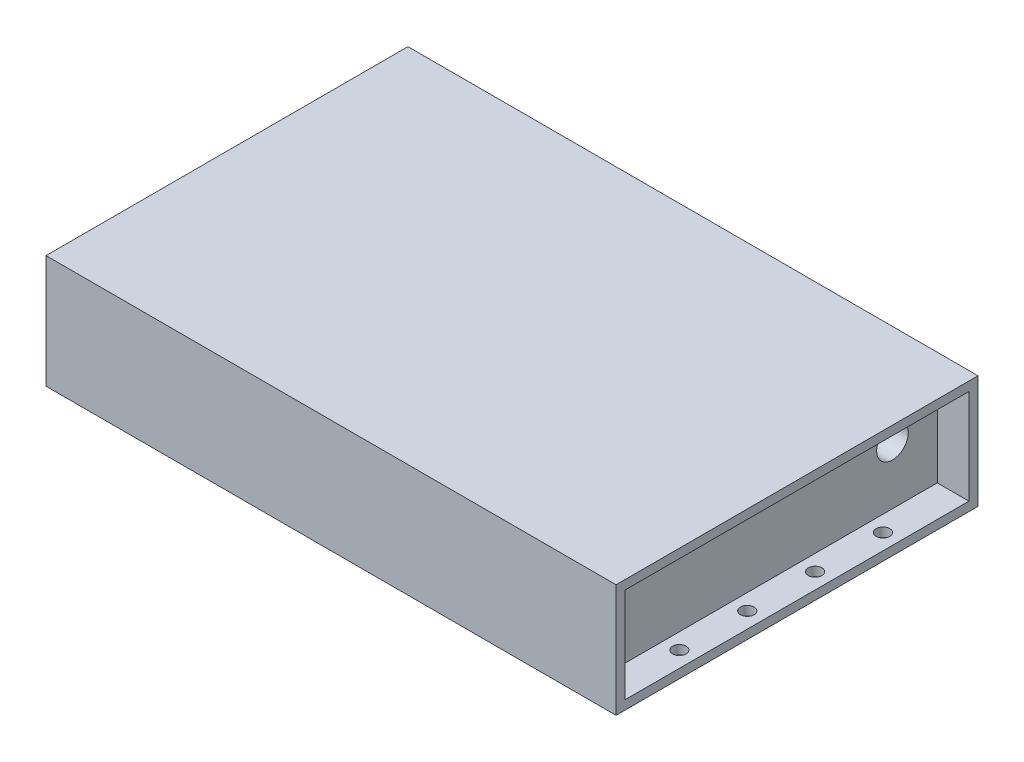
ISO-10303-21;
HEADER;
FILE_DESCRIPTION(('STEP AP214'),'2;1');
FILE_NAME('part.step','',(''),(''),'','','');
FILE_SCHEMA(('AUTOMOTIVE_DESIGN { 1 0 10303 214 1 1 1 1 }'));
ENDSEC;
DATA;
#1=APPLICATION_CONTEXT('core data for automotive mechanical design processes');
#2=APPLICATION_PROTOCOL_DEFINITION('international standard','automotive_design',2000,#1);
#3=PRODUCT_CONTEXT('',#1,'mechanical');
#4=PRODUCT('Part','Part','',(#3));
#5=PRODUCT_RELATED_PRODUCT_CATEGORY('part','',(#4));
#6=PRODUCT_DEFINITION_FORMATION('','',#4);
#7=PRODUCT_DEFINITION_CONTEXT('part definition',#1,'design');
#8=PRODUCT_DEFINITION('design','',#6,#7);
#9=PRODUCT_DEFINITION_SHAPE('','',#8);
#10=(LENGTH_UNIT() NAMED_UNIT(*) SI_UNIT(.MILLI.,.METRE.));
#11=(NAMED_UNIT(*) PLANE_ANGLE_UNIT() SI_UNIT($,.RADIAN.));
#12=(NAMED_UNIT(*) SI_UNIT($,.STERADIAN.) SOLID_ANGLE_UNIT());
#13=UNCERTAINTY_MEASURE_WITH_UNIT(LENGTH_MEASURE(1.E-05),#10,'distance_accuracy_value','');
#14=(GEOMETRIC_REPRESENTATION_CONTEXT(3) GLOBAL_UNCERTAINTY_ASSIGNED_CONTEXT((#13)) GLOBAL_UNIT_ASSIGNED_CONTEXT((#10,
#11,#12)) REPRESENTATION_CONTEXT('',''));
#15=CARTESIAN_POINT('',(0.,0.,0.));
#16=DIRECTION('',(0.,0.,1.));
#17=DIRECTION('',(1.,0.,0.));
#18=AXIS2_PLACEMENT_3D('',#15,#16,#17);
#19=CARTESIAN_POINT('',(0.,25.,0.));
#20=DIRECTION('',(1.,0.,0.));
#21=DIRECTION('',(0.,0.,-1.));
#22=AXIS2_PLACEMENT_3D('',#19,#20,#21);
#23=PLANE('',#22);
#24=DIRECTION('',(0.,0.,1.));
#25=VECTOR('',#24,1.);
#26=CARTESIAN_POINT('',(0.,2.,2.));
#27=LINE('',#26,#25);
#28=CARTESIAN_POINT('',(0.,2.,2.));
#29=VERTEX_POINT('',#28);
#30=CARTESIAN_POINT('',(0.,2.,78.));
#31=VERTEX_POINT('',#30);
#32=EDGE_CURVE('E152',#29,#31,#27,.T.);
#33=ORIENTED_EDGE('',*,*,#32,.F.);
#34=DIRECTION('',(0.,-1.,0.));
#35=VECTOR('',#34,1.);
#36=CARTESIAN_POINT('',(0.,23.,2.));
#37=LINE('',#36,#35);
#38=CARTESIAN_POINT('',(0.,23.,2.));
#39=VERTEX_POINT('',#38);
#40=EDGE_CURVE('E46',#39,#29,#37,.T.);
#41=ORIENTED_EDGE('',*,*,#40,.F.);
#42=DIRECTION('',(0.,0.,-1.));
#43=VECTOR('',#42,1.);
#44=CARTESIAN_POINT('',(0.,23.,2.));
#45=LINE('',#44,#43);
#46=CARTESIAN_POINT('',(0.,23.,78.));
#47=VERTEX_POINT('',#46);
#48=EDGE_CURVE('E140',#47,#39,#45,.T.);
#49=ORIENTED_EDGE('',*,*,#48,.F.);
#50=DIRECTION('',(0.,1.,0.));
#51=VECTOR('',#50,1.);
#52=CARTESIAN_POINT('',(0.,23.,78.));
#53=LINE('',#52,#51);
#54=EDGE_CURVE('E143',#31,#47,#53,.T.);
#55=ORIENTED_EDGE('',*,*,#54,.F.);
#56=EDGE_LOOP('',(#33,#41,#49,#55));
#57=FACE_BOUND('',#56,.T.);
#58=DIRECTION('',(0.,0.,1.));
#59=VECTOR('',#58,1.);
#60=CARTESIAN_POINT('',(0.,0.,0.));
#61=LINE('',#60,#59);
#62=CARTESIAN_POINT('',(0.,0.,0.));
#63=VERTEX_POINT('',#62);
#64=CARTESIAN_POINT('',(0.,0.,80.));
#65=VERTEX_POINT('',#64);
#66=EDGE_CURVE('E187',#63,#65,#61,.T.);
#67=ORIENTED_EDGE('',*,*,#66,.T.);
#68=DIRECTION('',(0.,-1.,0.));
#69=VECTOR('',#68,1.);
#70=CARTESIAN_POINT('',(0.,25.,80.));
#71=LINE('',#70,#69);
#72=CARTESIAN_POINT('',(0.,25.,80.));
#73=VERTEX_POINT('',#72);
#74=EDGE_CURVE('E11',#73,#65,#71,.T.);
#75=ORIENTED_EDGE('',*,*,#74,.F.);
#76=DIRECTION('',(0.,0.,1.));
#77=VECTOR('',#76,1.);
#78=CARTESIAN_POINT('',(0.,25.,0.));
#79=LINE('',#78,#77);
#80=CARTESIAN_POINT('',(0.,25.,0.));
#81=VERTEX_POINT('',#80);
#82=EDGE_CURVE('E193',#81,#73,#79,.T.);
#83=ORIENTED_EDGE('',*,*,#82,.F.);
#84=DIRECTION('',(0.,-1.,0.));
#85=VECTOR('',#84,1.);
#86=CARTESIAN_POINT('',(0.,25.,0.));
#87=LINE('',#86,#85);
#88=EDGE_CURVE('E203',#81,#63,#87,.T.);
#89=ORIENTED_EDGE('',*,*,#88,.T.);
#90=EDGE_LOOP('',(#67,#75,#83,#89));
#91=FACE_BOUND('',#90,.T.);
#92=ADVANCED_FACE('F32',(#57,#91),#23,.F.);
#93=CARTESIAN_POINT('',(0.,25.,80.));
#94=DIRECTION('',(0.,0.,-1.));
#95=DIRECTION('',(-1.,0.,0.));
#96=AXIS2_PLACEMENT_3D('',#93,#94,#95);
#97=PLANE('',#96);
#98=DIRECTION('',(1.,0.,0.));
#99=VECTOR('',#98,1.);
#100=CARTESIAN_POINT('',(0.,0.,80.));
#101=LINE('',#100,#99);
#102=CARTESIAN_POINT('',(126.,0.,80.));
#103=VERTEX_POINT('',#102);
#104=EDGE_CURVE('E206',#65,#103,#101,.T.);
#105=ORIENTED_EDGE('',*,*,#104,.T.);
#106=DIRECTION('',(0.,-1.,0.));
#107=VECTOR('',#106,1.);
#108=CARTESIAN_POINT('',(126.,25.,80.));
#109=LINE('',#108,#107);
#110=CARTESIAN_POINT('',(126.,25.,80.));
#111=VERTEX_POINT('',#110);
#112=EDGE_CURVE('E39',#111,#103,#109,.T.);
#113=ORIENTED_EDGE('',*,*,#112,.F.);
#114=DIRECTION('',(1.,0.,0.));
#115=VECTOR('',#114,1.);
#116=CARTESIAN_POINT('',(0.,25.,80.));
#117=LINE('',#116,#115);
#118=EDGE_CURVE('E196',#73,#111,#117,.T.);
#119=ORIENTED_EDGE('',*,*,#118,.F.);
#120=ORIENTED_EDGE('',*,*,#74,.T.);
#121=EDGE_LOOP('',(#105,#113,#119,#120));
#122=FACE_BOUND('',#121,.T.);
#123=ADVANCED_FACE('F236',(#122),#97,.F.);
#124=CARTESIAN_POINT('',(126.,25.,0.));
#125=DIRECTION('',(-1.,0.,0.));
#126=DIRECTION('',(0.,0.,1.));
#127=AXIS2_PLACEMENT_3D('',#124,#125,#126);
#128=PLANE('',#127);
#129=DIRECTION('',(0.,0.,-1.));
#130=VECTOR('',#129,1.);
#131=CARTESIAN_POINT('',(126.,2.,78.));
#132=LINE('',#131,#130);
#133=CARTESIAN_POINT('',(126.,2.,78.));
#134=VERTEX_POINT('',#133);
#135=CARTESIAN_POINT('',(126.,2.,2.));
#136=VERTEX_POINT('',#135);
#137=EDGE_CURVE('E177',#134,#136,#132,.T.);
#138=ORIENTED_EDGE('',*,*,#137,.F.);
#139=DIRECTION('',(0.,-1.,0.));
#140=VECTOR('',#139,1.);
#141=CARTESIAN_POINT('',(126.,23.,78.));
#142=LINE('',#141,#140);
#143=CARTESIAN_POINT('',(126.,23.,78.));
#144=VERTEX_POINT('',#143);
#145=EDGE_CURVE('E54',#144,#134,#142,.T.);
#146=ORIENTED_EDGE('',*,*,#145,.F.);
#147=DIRECTION('',(0.,0.,1.));
#148=VECTOR('',#147,1.);
#149=CARTESIAN_POINT('',(126.,23.,78.));
#150=LINE('',#149,#148);
#151=CARTESIAN_POINT('',(126.,23.,2.));
#152=VERTEX_POINT('',#151);
#153=EDGE_CURVE('E166',#152,#144,#150,.T.);
#154=ORIENTED_EDGE('',*,*,#153,.F.);
#155=DIRECTION('',(0.,1.,0.));
#156=VECTOR('',#155,1.);
#157=CARTESIAN_POINT('',(126.,23.,2.));
#158=LINE('',#157,#156);
#159=EDGE_CURVE('E180',#136,#152,#158,.T.);
#160=ORIENTED_EDGE('',*,*,#159,.F.);
#161=EDGE_LOOP('',(#138,#146,#154,#160));
#162=FACE_BOUND('',#161,.T.);
#163=DIRECTION('',(0.,0.,-1.));
#164=VECTOR('',#163,1.);
#165=CARTESIAN_POINT('',(126.,0.,0.));
#166=LINE('',#165,#164);
#167=CARTESIAN_POINT('',(126.,0.,0.));
#168=VERTEX_POINT('',#167);
#169=EDGE_CURVE('E208',#103,#168,#166,.T.);
#170=ORIENTED_EDGE('',*,*,#169,.T.);
#171=DIRECTION('',(0.,-1.,0.));
#172=VECTOR('',#171,1.);
#173=CARTESIAN_POINT('',(126.,25.,0.));
#174=LINE('',#173,#172);
#175=CARTESIAN_POINT('',(126.,25.,0.));
#176=VERTEX_POINT('',#175);
#177=EDGE_CURVE('E213',#176,#168,#174,.T.);
#178=ORIENTED_EDGE('',*,*,#177,.F.);
#179=DIRECTION('',(0.,0.,-1.));
#180=VECTOR('',#179,1.);
#181=CARTESIAN_POINT('',(126.,25.,0.));
#182=LINE('',#181,#180);
#183=EDGE_CURVE('E199',#111,#176,#182,.T.);
#184=ORIENTED_EDGE('',*,*,#183,.F.);
#185=ORIENTED_EDGE('',*,*,#112,.T.);
#186=EDGE_LOOP('',(#170,#178,#184,#185));
#187=FACE_BOUND('',#186,.T.);
#188=ADVANCED_FACE('F220',(#162,#187),#128,.F.);
#189=CARTESIAN_POINT('',(0.,25.,0.));
#190=DIRECTION('',(0.,0.,1.));
#191=DIRECTION('',(1.,0.,0.));
#192=AXIS2_PLACEMENT_3D('',#189,#190,#191);
#193=PLANE('',#192);
#194=DIRECTION('',(-1.,0.,0.));
#195=VECTOR('',#194,1.);
#196=CARTESIAN_POINT('',(0.,0.,0.));
#197=LINE('',#196,#195);
#198=EDGE_CURVE('E197',#168,#63,#197,.T.);
#199=ORIENTED_EDGE('',*,*,#198,.T.);
#200=ORIENTED_EDGE('',*,*,#88,.F.);
#201=DIRECTION('',(-1.,0.,0.));
#202=VECTOR('',#201,1.);
#203=CARTESIAN_POINT('',(0.,25.,0.));
#204=LINE('',#203,#202);
#205=EDGE_CURVE('E201',#176,#81,#204,.T.);
#206=ORIENTED_EDGE('',*,*,#205,.F.);
#207=ORIENTED_EDGE('',*,*,#177,.T.);
#208=EDGE_LOOP('',(#199,#200,#206,#207));
#209=FACE_BOUND('',#208,.T.);
#210=ADVANCED_FACE('F229',(#209),#193,.F.);
#211=CARTESIAN_POINT('',(0.,25.,0.));
#212=DIRECTION('',(0.,1.,0.));
#213=DIRECTION('',(0.,0.,1.));
#214=AXIS2_PLACEMENT_3D('',#211,#212,#213);
#215=PLANE('',#214);
#216=ORIENTED_EDGE('',*,*,#82,.T.);
#217=ORIENTED_EDGE('',*,*,#118,.T.);
#218=ORIENTED_EDGE('',*,*,#183,.T.);
#219=ORIENTED_EDGE('',*,*,#205,.T.);
#220=EDGE_LOOP('',(#216,#217,#218,#219));
#221=FACE_BOUND('',#220,.T.);
#222=ADVANCED_FACE('F235',(#221),#215,.T.);
#223=CARTESIAN_POINT('',(0.,0.,0.));
#224=DIRECTION('',(0.,1.,0.));
#225=DIRECTION('',(0.,0.,1.));
#226=AXIS2_PLACEMENT_3D('',#223,#224,#225);
#227=PLANE('',#226);
#228=CARTESIAN_POINT('',(3.5,0.,17.5));
#229=DIRECTION('',(0.,1.,0.));
#230=DIRECTION('',(0.,0.,1.));
#231=AXIS2_PLACEMENT_3D('',#228,#229,#230);
#232=CIRCLE('',#231,1.5);
#233=CARTESIAN_POINT('',(3.5,0.,19.));
#234=VERTEX_POINT('',#233);
#235=EDGE_CURVE('E334',#234,#234,#232,.T.);
#236=ORIENTED_EDGE('',*,*,#235,.T.);
#237=EDGE_LOOP('',(#236));
#238=FACE_BOUND('',#237,.T.);
#239=CARTESIAN_POINT('',(3.5,0.,32.5));
#240=DIRECTION('',(0.,1.,0.));
#241=DIRECTION('',(0.,0.,1.));
#242=AXIS2_PLACEMENT_3D('',#239,#240,#241);
#243=CIRCLE('',#242,1.5);
#244=CARTESIAN_POINT('',(3.5,0.,34.));
#245=VERTEX_POINT('',#244);
#246=EDGE_CURVE('E336',#245,#245,#243,.T.);
#247=ORIENTED_EDGE('',*,*,#246,.T.);
#248=EDGE_LOOP('',(#247));
#249=FACE_BOUND('',#248,.T.);
#250=CARTESIAN_POINT('',(3.50000000000001,0.,47.5));
#251=DIRECTION('',(0.,1.,0.));
#252=DIRECTION('',(0.,0.,1.));
#253=AXIS2_PLACEMENT_3D('',#250,#251,#252);
#254=CIRCLE('',#253,1.5);
#255=CARTESIAN_POINT('',(3.50000000000001,0.,49.));
#256=VERTEX_POINT('',#255);
#257=EDGE_CURVE('E342',#256,#256,#254,.T.);
#258=ORIENTED_EDGE('',*,*,#257,.T.);
#259=EDGE_LOOP('',(#258));
#260=FACE_BOUND('',#259,.T.);
#261=CARTESIAN_POINT('',(3.50000000000001,0.,62.5));
#262=DIRECTION('',(0.,1.,0.));
#263=DIRECTION('',(0.,0.,1.));
#264=AXIS2_PLACEMENT_3D('',#261,#262,#263);
#265=CIRCLE('',#264,1.5);
#266=CARTESIAN_POINT('',(3.50000000000001,0.,64.));
#267=VERTEX_POINT('',#266);
#268=EDGE_CURVE('E400',#267,#267,#265,.T.);
#269=ORIENTED_EDGE('',*,*,#268,.T.);
#270=EDGE_LOOP('',(#269));
#271=FACE_BOUND('',#270,.T.);
#272=CARTESIAN_POINT('',(122.5,0.,17.5));
#273=DIRECTION('',(0.,1.,0.));
#274=DIRECTION('',(0.,0.,1.));
#275=AXIS2_PLACEMENT_3D('',#272,#273,#274);
#276=CIRCLE('',#275,1.5);
#277=CARTESIAN_POINT('',(122.5,0.,19.));
#278=VERTEX_POINT('',#277);
#279=EDGE_CURVE('E363',#278,#278,#276,.T.);
#280=ORIENTED_EDGE('',*,*,#279,.T.);
#281=EDGE_LOOP('',(#280));
#282=FACE_BOUND('',#281,.T.);
#283=CARTESIAN_POINT('',(122.5,0.,32.5));
#284=DIRECTION('',(0.,1.,0.));
#285=DIRECTION('',(0.,0.,1.));
#286=AXIS2_PLACEMENT_3D('',#283,#284,#285);
#287=CIRCLE('',#286,1.5);
#288=CARTESIAN_POINT('',(122.5,0.,34.));
#289=VERTEX_POINT('',#288);
#290=EDGE_CURVE('E360',#289,#289,#287,.T.);
#291=ORIENTED_EDGE('',*,*,#290,.T.);
#292=EDGE_LOOP('',(#291));
#293=FACE_BOUND('',#292,.T.);
#294=CARTESIAN_POINT('',(122.5,0.,47.5));
#295=DIRECTION('',(0.,1.,0.));
#296=DIRECTION('',(0.,0.,1.));
#297=AXIS2_PLACEMENT_3D('',#294,#295,#296);
#298=CIRCLE('',#297,1.5);
#299=CARTESIAN_POINT('',(122.5,0.,49.));
#300=VERTEX_POINT('',#299);
#301=EDGE_CURVE('E357',#300,#300,#298,.T.);
#302=ORIENTED_EDGE('',*,*,#301,.T.);
#303=EDGE_LOOP('',(#302));
#304=FACE_BOUND('',#303,.T.);
#305=CARTESIAN_POINT('',(122.5,0.,62.5));
#306=DIRECTION('',(0.,1.,0.));
#307=DIRECTION('',(0.,0.,1.));
#308=AXIS2_PLACEMENT_3D('',#305,#306,#307);
#309=CIRCLE('',#308,1.5);
#310=CARTESIAN_POINT('',(122.5,0.,64.));
#311=VERTEX_POINT('',#310);
#312=EDGE_CURVE('E349',#311,#311,#309,.T.);
#313=ORIENTED_EDGE('',*,*,#312,.T.);
#314=EDGE_LOOP('',(#313));
#315=FACE_BOUND('',#314,.T.);
#316=ORIENTED_EDGE('',*,*,#66,.F.);
#317=ORIENTED_EDGE('',*,*,#198,.F.);
#318=ORIENTED_EDGE('',*,*,#169,.F.);
#319=ORIENTED_EDGE('',*,*,#104,.F.);
#320=EDGE_LOOP('',(#316,#317,#318,#319));
#321=FACE_BOUND('',#320,.T.);
#322=ADVANCED_FACE('F226',(#238,#249,#260,#271,#282,#293,#304,#315,#321),#227,.F.);
#323=CARTESIAN_POINT('',(119.,23.,78.));
#324=DIRECTION('',(0.,0.,1.));
#325=DIRECTION('',(1.,0.,0.));
#326=AXIS2_PLACEMENT_3D('',#323,#324,#325);
#327=PLANE('',#326);
#328=ORIENTED_EDGE('',*,*,#145,.T.);
#329=DIRECTION('',(1.,0.,0.));
#330=VECTOR('',#329,1.);
#331=CARTESIAN_POINT('',(119.,2.,78.));
#332=LINE('',#331,#330);
#333=CARTESIAN_POINT('',(119.,2.,78.));
#334=VERTEX_POINT('',#333);
#335=EDGE_CURVE('E175',#334,#134,#332,.T.);
#336=ORIENTED_EDGE('',*,*,#335,.F.);
#337=DIRECTION('',(0.,-1.,0.));
#338=VECTOR('',#337,1.);
#339=CARTESIAN_POINT('',(119.,23.,78.));
#340=LINE('',#339,#338);
#341=CARTESIAN_POINT('',(119.,23.,78.));
#342=VERTEX_POINT('',#341);
#343=EDGE_CURVE('E162',#342,#334,#340,.T.);
#344=ORIENTED_EDGE('',*,*,#343,.F.);
#345=DIRECTION('',(1.,0.,0.));
#346=VECTOR('',#345,1.);
#347=CARTESIAN_POINT('',(119.,23.,78.));
#348=LINE('',#347,#346);
#349=EDGE_CURVE('E185',#342,#144,#348,.T.);
#350=ORIENTED_EDGE('',*,*,#349,.T.);
#351=EDGE_LOOP('',(#328,#336,#344,#350));
#352=FACE_BOUND('',#351,.T.);
#353=ADVANCED_FACE('F250',(#352),#327,.F.);
#354=CARTESIAN_POINT('',(119.,23.,78.));
#355=DIRECTION('',(0.,1.,0.));
#356=DIRECTION('',(0.,0.,1.));
#357=AXIS2_PLACEMENT_3D('',#354,#355,#356);
#358=PLANE('',#357);
#359=ORIENTED_EDGE('',*,*,#153,.T.);
#360=ORIENTED_EDGE('',*,*,#349,.F.);
#361=DIRECTION('',(0.,0.,1.));
#362=VECTOR('',#361,1.);
#363=CARTESIAN_POINT('',(119.,23.,78.));
#364=LINE('',#363,#362);
#365=CARTESIAN_POINT('',(119.,23.,2.));
#366=VERTEX_POINT('',#365);
#367=EDGE_CURVE('E172',#366,#342,#364,.T.);
#368=ORIENTED_EDGE('',*,*,#367,.F.);
#369=DIRECTION('',(1.,0.,0.));
#370=VECTOR('',#369,1.);
#371=CARTESIAN_POINT('',(119.,23.,2.));
#372=LINE('',#371,#370);
#373=EDGE_CURVE('E188',#366,#152,#372,.T.);
#374=ORIENTED_EDGE('',*,*,#373,.T.);
#375=EDGE_LOOP('',(#359,#360,#368,#374));
#376=FACE_BOUND('',#375,.T.);
#377=ADVANCED_FACE('F256',(#376),#358,.F.);
#378=CARTESIAN_POINT('',(119.,23.,2.));
#379=DIRECTION('',(0.,0.,-1.));
#380=DIRECTION('',(-1.,0.,0.));
#381=AXIS2_PLACEMENT_3D('',#378,#379,#380);
#382=PLANE('',#381);
#383=ORIENTED_EDGE('',*,*,#159,.T.);
#384=ORIENTED_EDGE('',*,*,#373,.F.);
#385=DIRECTION('',(0.,1.,0.));
#386=VECTOR('',#385,1.);
#387=CARTESIAN_POINT('',(119.,23.,2.));
#388=LINE('',#387,#386);
#389=CARTESIAN_POINT('',(119.,2.,2.));
#390=VERTEX_POINT('',#389);
#391=EDGE_CURVE('E169',#390,#366,#388,.T.);
#392=ORIENTED_EDGE('',*,*,#391,.F.);
#393=DIRECTION('',(1.,0.,0.));
#394=VECTOR('',#393,1.);
#395=CARTESIAN_POINT('',(119.,2.,2.));
#396=LINE('',#395,#394);
#397=EDGE_CURVE('E190',#390,#136,#396,.T.);
#398=ORIENTED_EDGE('',*,*,#397,.T.);
#399=EDGE_LOOP('',(#383,#384,#392,#398));
#400=FACE_BOUND('',#399,.T.);
#401=ADVANCED_FACE('F261',(#400),#382,.F.);
#402=CARTESIAN_POINT('',(119.,2.,78.));
#403=DIRECTION('',(0.,-1.,0.));
#404=DIRECTION('',(0.,0.,-1.));
#405=AXIS2_PLACEMENT_3D('',#402,#403,#404);
#406=PLANE('',#405);
#407=CARTESIAN_POINT('',(122.5,2.,17.5));
#408=DIRECTION('',(0.,1.,0.));
#409=DIRECTION('',(0.,0.,1.));
#410=AXIS2_PLACEMENT_3D('',#407,#408,#409);
#411=CIRCLE('',#410,1.5);
#412=CARTESIAN_POINT('',(122.5,2.,19.));
#413=VERTEX_POINT('',#412);
#414=EDGE_CURVE('E346',#413,#413,#411,.T.);
#415=ORIENTED_EDGE('',*,*,#414,.F.);
#416=EDGE_LOOP('',(#415));
#417=FACE_BOUND('',#416,.T.);
#418=CARTESIAN_POINT('',(122.5,2.,32.5));
#419=DIRECTION('',(0.,1.,0.));
#420=DIRECTION('',(0.,0.,1.));
#421=AXIS2_PLACEMENT_3D('',#418,#419,#420);
#422=CIRCLE('',#421,1.5);
#423=CARTESIAN_POINT('',(122.5,2.,34.));
#424=VERTEX_POINT('',#423);
#425=EDGE_CURVE('E350',#424,#424,#422,.T.);
#426=ORIENTED_EDGE('',*,*,#425,.F.);
#427=EDGE_LOOP('',(#426));
#428=FACE_BOUND('',#427,.T.);
#429=CARTESIAN_POINT('',(122.5,2.,47.5));
#430=DIRECTION('',(0.,1.,0.));
#431=DIRECTION('',(0.,0.,1.));
#432=AXIS2_PLACEMENT_3D('',#429,#430,#431);
#433=CIRCLE('',#432,1.5);
#434=CARTESIAN_POINT('',(122.5,2.,49.));
#435=VERTEX_POINT('',#434);
#436=EDGE_CURVE('E339',#435,#435,#433,.T.);
#437=ORIENTED_EDGE('',*,*,#436,.F.);
#438=EDGE_LOOP('',(#437));
#439=FACE_BOUND('',#438,.T.);
#440=CARTESIAN_POINT('',(122.5,2.,62.5));
#441=DIRECTION('',(0.,1.,0.));
#442=DIRECTION('',(0.,0.,1.));
#443=AXIS2_PLACEMENT_3D('',#440,#441,#442);
#444=CIRCLE('',#443,1.5);
#445=CARTESIAN_POINT('',(122.5,2.,64.));
#446=VERTEX_POINT('',#445);
#447=EDGE_CURVE('E335',#446,#446,#444,.T.);
#448=ORIENTED_EDGE('',*,*,#447,.F.);
#449=EDGE_LOOP('',(#448));
#450=FACE_BOUND('',#449,.T.);
#451=ORIENTED_EDGE('',*,*,#137,.T.);
#452=ORIENTED_EDGE('',*,*,#397,.F.);
#453=DIRECTION('',(0.,0.,-1.));
#454=VECTOR('',#453,1.);
#455=CARTESIAN_POINT('',(119.,2.,78.));
#456=LINE('',#455,#454);
#457=EDGE_CURVE('E165',#334,#390,#456,.T.);
#458=ORIENTED_EDGE('',*,*,#457,.F.);
#459=ORIENTED_EDGE('',*,*,#335,.T.);
#460=EDGE_LOOP('',(#451,#452,#458,#459));
#461=FACE_BOUND('',#460,.T.);
#462=ADVANCED_FACE('F257',(#417,#428,#439,#450,#461),#406,.F.);
#463=CARTESIAN_POINT('',(119.,0.,0.));
#464=DIRECTION('',(1.,0.,0.));
#465=DIRECTION('',(0.,0.,-1.));
#466=AXIS2_PLACEMENT_3D('',#463,#464,#465);
#467=PLANE('',#466);
#468=CARTESIAN_POINT('',(119.,14.8413619065994,11.905187790027));
#469=DIRECTION('',(1.,0.,0.));
#470=DIRECTION('',(0.,0.,-1.));
#471=AXIS2_PLACEMENT_3D('',#468,#469,#470);
#472=CIRCLE('',#471,3.5);
#473=CARTESIAN_POINT('',(119.,14.8413619065994,8.40518779002697));
#474=VERTEX_POINT('',#473);
#475=EDGE_CURVE('E146',#474,#474,#472,.T.);
#476=ORIENTED_EDGE('',*,*,#475,.F.);
#477=EDGE_LOOP('',(#476));
#478=FACE_BOUND('',#477,.T.);
#479=ORIENTED_EDGE('',*,*,#343,.T.);
#480=ORIENTED_EDGE('',*,*,#457,.T.);
#481=ORIENTED_EDGE('',*,*,#391,.T.);
#482=ORIENTED_EDGE('',*,*,#367,.T.);
#483=EDGE_LOOP('',(#479,#480,#481,#482));
#484=FACE_BOUND('',#483,.T.);
#485=ADVANCED_FACE('F260',(#478,#484),#467,.T.);
#486=CARTESIAN_POINT('',(7.,23.,2.));
#487=DIRECTION('',(0.,0.,-1.));
#488=DIRECTION('',(0.,1.,0.));
#489=AXIS2_PLACEMENT_3D('',#486,#487,#488);
#490=PLANE('',#489);
#491=ORIENTED_EDGE('',*,*,#40,.T.);
#492=DIRECTION('',(-1.,0.,0.));
#493=VECTOR('',#492,1.);
#494=CARTESIAN_POINT('',(7.,2.,2.));
#495=LINE('',#494,#493);
#496=CARTESIAN_POINT('',(7.,2.,2.));
#497=VERTEX_POINT('',#496);
#498=EDGE_CURVE('E118',#497,#29,#495,.T.);
#499=ORIENTED_EDGE('',*,*,#498,.F.);
#500=DIRECTION('',(0.,-1.,0.));
#501=VECTOR('',#500,1.);
#502=CARTESIAN_POINT('',(7.,23.,2.));
#503=LINE('',#502,#501);
#504=CARTESIAN_POINT('',(7.,23.,2.));
#505=VERTEX_POINT('',#504);
#506=EDGE_CURVE('E122',#505,#497,#503,.T.);
#507=ORIENTED_EDGE('',*,*,#506,.F.);
#508=DIRECTION('',(-1.,0.,0.));
#509=VECTOR('',#508,1.);
#510=CARTESIAN_POINT('',(7.,23.,2.));
#511=LINE('',#510,#509);
#512=EDGE_CURVE('E157',#505,#39,#511,.T.);
#513=ORIENTED_EDGE('',*,*,#512,.T.);
#514=EDGE_LOOP('',(#491,#499,#507,#513));
#515=FACE_BOUND('',#514,.T.);
#516=ADVANCED_FACE('F120',(#515),#490,.F.);
#517=CARTESIAN_POINT('',(7.,23.,2.));
#518=DIRECTION('',(0.,1.,0.));
#519=DIRECTION('',(0.,0.,1.));
#520=AXIS2_PLACEMENT_3D('',#517,#518,#519);
#521=PLANE('',#520);
#522=ORIENTED_EDGE('',*,*,#48,.T.);
#523=ORIENTED_EDGE('',*,*,#512,.F.);
#524=DIRECTION('',(0.,0.,-1.));
#525=VECTOR('',#524,1.);
#526=CARTESIAN_POINT('',(7.,23.,2.));
#527=LINE('',#526,#525);
#528=CARTESIAN_POINT('',(7.00000000000001,23.,78.));
#529=VERTEX_POINT('',#528);
#530=EDGE_CURVE('E128',#529,#505,#527,.T.);
#531=ORIENTED_EDGE('',*,*,#530,.F.);
#532=DIRECTION('',(-1.,0.,0.));
#533=VECTOR('',#532,1.);
#534=CARTESIAN_POINT('',(7.00000000000001,23.,78.));
#535=LINE('',#534,#533);
#536=EDGE_CURVE('E159',#529,#47,#535,.T.);
#537=ORIENTED_EDGE('',*,*,#536,.T.);
#538=EDGE_LOOP('',(#522,#523,#531,#537));
#539=FACE_BOUND('',#538,.T.);
#540=ADVANCED_FACE('F274',(#539),#521,.F.);
#541=CARTESIAN_POINT('',(7.00000000000001,23.,78.));
#542=DIRECTION('',(0.,0.,1.));
#543=DIRECTION('',(1.,0.,0.));
#544=AXIS2_PLACEMENT_3D('',#541,#542,#543);
#545=PLANE('',#544);
#546=ORIENTED_EDGE('',*,*,#54,.T.);
#547=ORIENTED_EDGE('',*,*,#536,.F.);
#548=DIRECTION('',(0.,1.,0.));
#549=VECTOR('',#548,1.);
#550=CARTESIAN_POINT('',(7.00000000000001,23.,78.));
#551=LINE('',#550,#549);
#552=CARTESIAN_POINT('',(7.00000000000001,2.,78.));
#553=VERTEX_POINT('',#552);
#554=EDGE_CURVE('E136',#553,#529,#551,.T.);
#555=ORIENTED_EDGE('',*,*,#554,.F.);
#556=DIRECTION('',(-1.,0.,0.));
#557=VECTOR('',#556,1.);
#558=CARTESIAN_POINT('',(7.00000000000001,2.,78.));
#559=LINE('',#558,#557);
#560=EDGE_CURVE('E127',#553,#31,#559,.T.);
#561=ORIENTED_EDGE('',*,*,#560,.T.);
#562=EDGE_LOOP('',(#546,#547,#555,#561));
#563=FACE_BOUND('',#562,.T.);
#564=ADVANCED_FACE('F277',(#563),#545,.F.);
#565=CARTESIAN_POINT('',(7.,2.,2.));
#566=DIRECTION('',(0.,-1.,0.));
#567=DIRECTION('',(0.,0.,-1.));
#568=AXIS2_PLACEMENT_3D('',#565,#566,#567);
#569=PLANE('',#568);
#570=CARTESIAN_POINT('',(3.5,2.,17.5));
#571=DIRECTION('',(0.,1.,0.));
#572=DIRECTION('',(0.,0.,1.));
#573=AXIS2_PLACEMENT_3D('',#570,#571,#572);
#574=CIRCLE('',#573,1.5);
#575=CARTESIAN_POINT('',(3.5,2.,19.));
#576=VERTEX_POINT('',#575);
#577=EDGE_CURVE('E331',#576,#576,#574,.T.);
#578=ORIENTED_EDGE('',*,*,#577,.F.);
#579=EDGE_LOOP('',(#578));
#580=FACE_BOUND('',#579,.T.);
#581=CARTESIAN_POINT('',(3.5,2.,32.5));
#582=DIRECTION('',(0.,1.,0.));
#583=DIRECTION('',(0.,0.,1.));
#584=AXIS2_PLACEMENT_3D('',#581,#582,#583);
#585=CIRCLE('',#584,1.5);
#586=CARTESIAN_POINT('',(3.5,2.,34.));
#587=VERTEX_POINT('',#586);
#588=EDGE_CURVE('E409',#587,#587,#585,.T.);
#589=ORIENTED_EDGE('',*,*,#588,.F.);
#590=EDGE_LOOP('',(#589));
#591=FACE_BOUND('',#590,.T.);
#592=CARTESIAN_POINT('',(3.50000000000001,2.,47.5));
#593=DIRECTION('',(0.,1.,0.));
#594=DIRECTION('',(0.,0.,1.));
#595=AXIS2_PLACEMENT_3D('',#592,#593,#594);
#596=CIRCLE('',#595,1.5);
#597=CARTESIAN_POINT('',(3.50000000000001,2.,49.));
#598=VERTEX_POINT('',#597);
#599=EDGE_CURVE('E406',#598,#598,#596,.T.);
#600=ORIENTED_EDGE('',*,*,#599,.F.);
#601=EDGE_LOOP('',(#600));
#602=FACE_BOUND('',#601,.T.);
#603=CARTESIAN_POINT('',(3.50000000000001,2.,62.5));
#604=DIRECTION('',(0.,1.,0.));
#605=DIRECTION('',(0.,0.,1.));
#606=AXIS2_PLACEMENT_3D('',#603,#604,#605);
#607=CIRCLE('',#606,1.5);
#608=CARTESIAN_POINT('',(3.50000000000001,2.,64.));
#609=VERTEX_POINT('',#608);
#610=EDGE_CURVE('E403',#609,#609,#607,.T.);
#611=ORIENTED_EDGE('',*,*,#610,.F.);
#612=EDGE_LOOP('',(#611));
#613=FACE_BOUND('',#612,.T.);
#614=ORIENTED_EDGE('',*,*,#32,.T.);
#615=ORIENTED_EDGE('',*,*,#560,.F.);
#616=DIRECTION('',(0.,0.,1.));
#617=VECTOR('',#616,1.);
#618=CARTESIAN_POINT('',(7.,2.,2.));
#619=LINE('',#618,#617);
#620=EDGE_CURVE('E131',#497,#553,#619,.T.);
#621=ORIENTED_EDGE('',*,*,#620,.F.);
#622=ORIENTED_EDGE('',*,*,#498,.T.);
#623=EDGE_LOOP('',(#614,#615,#621,#622));
#624=FACE_BOUND('',#623,.T.);
#625=ADVANCED_FACE('F132',(#580,#591,#602,#613,#624),#569,.F.);
#626=CARTESIAN_POINT('',(7.,0.,0.));
#627=DIRECTION('',(-1.,0.,0.));
#628=DIRECTION('',(0.,0.,1.));
#629=AXIS2_PLACEMENT_3D('',#626,#627,#628);
#630=PLANE('',#629);
#631=ORIENTED_EDGE('',*,*,#506,.T.);
#632=ORIENTED_EDGE('',*,*,#620,.T.);
#633=ORIENTED_EDGE('',*,*,#554,.T.);
#634=ORIENTED_EDGE('',*,*,#530,.T.);
#635=EDGE_LOOP('',(#631,#632,#633,#634));
#636=FACE_BOUND('',#635,.T.);
#637=ADVANCED_FACE('F138',(#636),#630,.T.);
#638=CARTESIAN_POINT('',(112.,14.8413619065994,11.905187790027));
#639=DIRECTION('',(1.,0.,0.));
#640=DIRECTION('',(0.,0.,-1.));
#641=AXIS2_PLACEMENT_3D('',#638,#639,#640);
#642=CYLINDRICAL_SURFACE('',#641,3.5);
#643=CARTESIAN_POINT('',(112.,14.8413619065994,11.905187790027));
#644=DIRECTION('',(1.,0.,0.));
#645=DIRECTION('',(0.,0.,-1.));
#646=AXIS2_PLACEMENT_3D('',#643,#644,#645);
#647=CIRCLE('',#646,3.5);
#648=CARTESIAN_POINT('',(112.,14.8413619065994,8.40518779002697));
#649=VERTEX_POINT('',#648);
#650=EDGE_CURVE('E153',#649,#649,#647,.T.);
#651=ORIENTED_EDGE('',*,*,#650,.F.);
#652=EDGE_LOOP('',(#651));
#653=FACE_BOUND('',#652,.T.);
#654=ORIENTED_EDGE('',*,*,#475,.T.);
#655=EDGE_LOOP('',(#654));
#656=FACE_BOUND('',#655,.T.);
#657=ADVANCED_FACE('F287',(#653,#656),#642,.F.);
#658=CARTESIAN_POINT('',(112.,14.8413619065994,11.905187790027));
#659=DIRECTION('',(1.,0.,0.));
#660=DIRECTION('',(0.,0.,-1.));
#661=AXIS2_PLACEMENT_3D('',#658,#659,#660);
#662=PLANE('',#661);
#663=ORIENTED_EDGE('',*,*,#650,.T.);
#664=EDGE_LOOP('',(#663));
#665=FACE_BOUND('',#664,.T.);
#666=ADVANCED_FACE('F290',(#665),#662,.T.);
#667=CARTESIAN_POINT('',(122.5,-21.,62.5));
#668=DIRECTION('',(0.,1.,0.));
#669=DIRECTION('',(0.,0.,1.));
#670=AXIS2_PLACEMENT_3D('',#667,#668,#669);
#671=CYLINDRICAL_SURFACE('',#670,1.5);
#672=ORIENTED_EDGE('',*,*,#447,.T.);
#673=EDGE_LOOP('',(#672));
#674=FACE_BOUND('',#673,.T.);
#675=ORIENTED_EDGE('',*,*,#312,.F.);
#676=EDGE_LOOP('',(#675));
#677=FACE_BOUND('',#676,.T.);
#678=ADVANCED_FACE('F294',(#674,#677),#671,.F.);
#679=CARTESIAN_POINT('',(122.5,-21.,47.5));
#680=DIRECTION('',(0.,1.,0.));
#681=DIRECTION('',(0.,0.,1.));
#682=AXIS2_PLACEMENT_3D('',#679,#680,#681);
#683=CYLINDRICAL_SURFACE('',#682,1.5);
#684=ORIENTED_EDGE('',*,*,#436,.T.);
#685=EDGE_LOOP('',(#684));
#686=FACE_BOUND('',#685,.T.);
#687=ORIENTED_EDGE('',*,*,#301,.F.);
#688=EDGE_LOOP('',(#687));
#689=FACE_BOUND('',#688,.T.);
#690=ADVANCED_FACE('F298',(#686,#689),#683,.F.);
#691=CARTESIAN_POINT('',(122.5,-21.,32.5));
#692=DIRECTION('',(0.,1.,0.));
#693=DIRECTION('',(0.,0.,1.));
#694=AXIS2_PLACEMENT_3D('',#691,#692,#693);
#695=CYLINDRICAL_SURFACE('',#694,1.5);
#696=ORIENTED_EDGE('',*,*,#425,.T.);
#697=EDGE_LOOP('',(#696));
#698=FACE_BOUND('',#697,.T.);
#699=ORIENTED_EDGE('',*,*,#290,.F.);
#700=EDGE_LOOP('',(#699));
#701=FACE_BOUND('',#700,.T.);
#702=ADVANCED_FACE('F302',(#698,#701),#695,.F.);
#703=CARTESIAN_POINT('',(122.5,-21.,17.5));
#704=DIRECTION('',(0.,1.,0.));
#705=DIRECTION('',(0.,0.,1.));
#706=AXIS2_PLACEMENT_3D('',#703,#704,#705);
#707=CYLINDRICAL_SURFACE('',#706,1.5);
#708=ORIENTED_EDGE('',*,*,#414,.T.);
#709=EDGE_LOOP('',(#708));
#710=FACE_BOUND('',#709,.T.);
#711=ORIENTED_EDGE('',*,*,#279,.F.);
#712=EDGE_LOOP('',(#711));
#713=FACE_BOUND('',#712,.T.);
#714=ADVANCED_FACE('F306',(#710,#713),#707,.F.);
#715=CARTESIAN_POINT('',(3.50000000000001,-21.,62.5));
#716=DIRECTION('',(0.,1.,0.));
#717=DIRECTION('',(0.,0.,1.));
#718=AXIS2_PLACEMENT_3D('',#715,#716,#717);
#719=CYLINDRICAL_SURFACE('',#718,1.5);
#720=ORIENTED_EDGE('',*,*,#610,.T.);
#721=EDGE_LOOP('',(#720));
#722=FACE_BOUND('',#721,.T.);
#723=ORIENTED_EDGE('',*,*,#268,.F.);
#724=EDGE_LOOP('',(#723));
#725=FACE_BOUND('',#724,.T.);
#726=ADVANCED_FACE('F310',(#722,#725),#719,.F.);
#727=CARTESIAN_POINT('',(3.50000000000001,-21.,47.5));
#728=DIRECTION('',(0.,1.,0.));
#729=DIRECTION('',(0.,0.,1.));
#730=AXIS2_PLACEMENT_3D('',#727,#728,#729);
#731=CYLINDRICAL_SURFACE('',#730,1.5);
#732=ORIENTED_EDGE('',*,*,#599,.T.);
#733=EDGE_LOOP('',(#732));
#734=FACE_BOUND('',#733,.T.);
#735=ORIENTED_EDGE('',*,*,#257,.F.);
#736=EDGE_LOOP('',(#735));
#737=FACE_BOUND('',#736,.T.);
#738=ADVANCED_FACE('F314',(#734,#737),#731,.F.);
#739=CARTESIAN_POINT('',(3.5,-21.,32.5));
#740=DIRECTION('',(0.,1.,0.));
#741=DIRECTION('',(0.,0.,1.));
#742=AXIS2_PLACEMENT_3D('',#739,#740,#741);
#743=CYLINDRICAL_SURFACE('',#742,1.5);
#744=ORIENTED_EDGE('',*,*,#588,.T.);
#745=EDGE_LOOP('',(#744));
#746=FACE_BOUND('',#745,.T.);
#747=ORIENTED_EDGE('',*,*,#246,.F.);
#748=EDGE_LOOP('',(#747));
#749=FACE_BOUND('',#748,.T.);
#750=ADVANCED_FACE('F318',(#746,#749),#743,.F.);
#751=CARTESIAN_POINT('',(3.5,-21.,17.5));
#752=DIRECTION('',(0.,1.,0.));
#753=DIRECTION('',(0.,0.,1.));
#754=AXIS2_PLACEMENT_3D('',#751,#752,#753);
#755=CYLINDRICAL_SURFACE('',#754,1.5);
#756=ORIENTED_EDGE('',*,*,#577,.T.);
#757=EDGE_LOOP('',(#756));
#758=FACE_BOUND('',#757,.T.);
#759=ORIENTED_EDGE('',*,*,#235,.F.);
#760=EDGE_LOOP('',(#759));
#761=FACE_BOUND('',#760,.T.);
#762=ADVANCED_FACE('F322',(#758,#761),#755,.F.);
#763=CLOSED_SHELL('',(#92,#123,#188,#210,#222,#322,#353,#377,#401,#462,#485,#516,#540,#564,#625,
#637,#657,#666,#678,#690,#702,#714,#726,#738,#750,#762));
#764=MANIFOLD_SOLID_BREP('B2',#763);
#765=ADVANCED_BREP_SHAPE_REPRESENTATION('',(#18,#764),#14);
#766=SHAPE_DEFINITION_REPRESENTATION(#9,#765);
ENDSEC;
END-ISO-10303-21;
